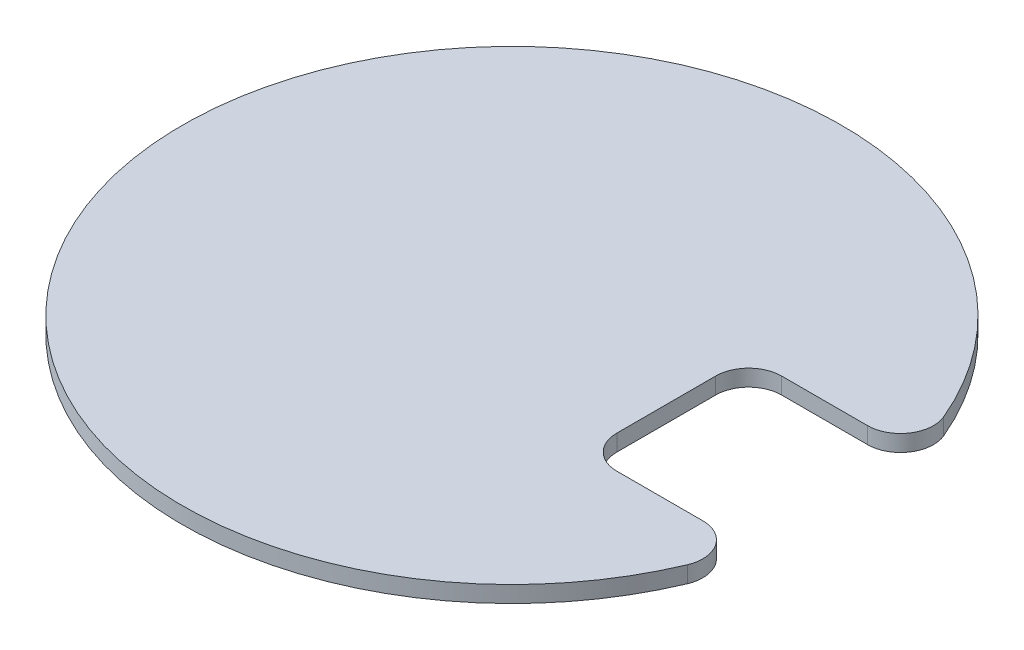
ISO-10303-21;
HEADER;
FILE_DESCRIPTION(('STEP AP214'),'2;1');
FILE_NAME('part.step','',(''),(''),'','','');
FILE_SCHEMA(('AUTOMOTIVE_DESIGN { 1 0 10303 214 1 1 1 1 }'));
ENDSEC;
DATA;
#1=APPLICATION_CONTEXT('core data for automotive mechanical design processes');
#2=APPLICATION_PROTOCOL_DEFINITION('international standard','automotive_design',2000,#1);
#3=PRODUCT_CONTEXT('',#1,'mechanical');
#4=PRODUCT('Part','Part','',(#3));
#5=PRODUCT_RELATED_PRODUCT_CATEGORY('part','',(#4));
#6=PRODUCT_DEFINITION_FORMATION('','',#4);
#7=PRODUCT_DEFINITION_CONTEXT('part definition',#1,'design');
#8=PRODUCT_DEFINITION('design','',#6,#7);
#9=PRODUCT_DEFINITION_SHAPE('','',#8);
#10=(LENGTH_UNIT() NAMED_UNIT(*) SI_UNIT(.MILLI.,.METRE.));
#11=(NAMED_UNIT(*) PLANE_ANGLE_UNIT() SI_UNIT($,.RADIAN.));
#12=(NAMED_UNIT(*) SI_UNIT($,.STERADIAN.) SOLID_ANGLE_UNIT());
#13=UNCERTAINTY_MEASURE_WITH_UNIT(LENGTH_MEASURE(1.E-05),#10,'distance_accuracy_value','');
#14=(GEOMETRIC_REPRESENTATION_CONTEXT(3) GLOBAL_UNCERTAINTY_ASSIGNED_CONTEXT((#13)) GLOBAL_UNIT_ASSIGNED_CONTEXT((#10,
#11,#12)) REPRESENTATION_CONTEXT('',''));
#15=CARTESIAN_POINT('',(0.,0.,0.));
#16=DIRECTION('',(0.,0.,1.));
#17=DIRECTION('',(1.,0.,0.));
#18=AXIS2_PLACEMENT_3D('',#15,#16,#17);
#19=CARTESIAN_POINT('',(11.3649167310371,1.,-3.));
#20=DIRECTION('',(0.,-1.,0.));
#21=DIRECTION('',(0.,0.,-1.));
#22=AXIS2_PLACEMENT_3D('',#19,#20,#21);
#23=CYLINDRICAL_SURFACE('',#22,2.);
#24=CARTESIAN_POINT('',(11.3649167310371,0.,-3.));
#25=DIRECTION('',(0.,-1.,0.));
#26=DIRECTION('',(0.,0.,1.));
#27=AXIS2_PLACEMENT_3D('',#24,#25,#26);
#28=CIRCLE('',#27,2.);
#29=CARTESIAN_POINT('',(9.36491673103708,0.,-2.99999999999999));
#30=VERTEX_POINT('',#29);
#31=CARTESIAN_POINT('',(11.3649167310371,0.,-5.));
#32=VERTEX_POINT('',#31);
#33=EDGE_CURVE('E208',#30,#32,#28,.T.);
#34=ORIENTED_EDGE('',*,*,#33,.T.);
#35=DIRECTION('',(0.,-1.,0.));
#36=VECTOR('',#35,1.);
#37=CARTESIAN_POINT('',(11.3649167310371,1.,-5.));
#38=LINE('',#37,#36);
#39=CARTESIAN_POINT('',(11.3649167310371,1.,-5.));
#40=VERTEX_POINT('',#39);
#41=EDGE_CURVE('E12',#40,#32,#38,.T.);
#42=ORIENTED_EDGE('',*,*,#41,.F.);
#43=CARTESIAN_POINT('',(11.3649167310371,1.,-3.));
#44=DIRECTION('',(0.,-1.,0.));
#45=DIRECTION('',(0.,0.,1.));
#46=AXIS2_PLACEMENT_3D('',#43,#44,#45);
#47=CIRCLE('',#46,2.);
#48=CARTESIAN_POINT('',(9.36491673103708,1.,-2.99999999999999));
#49=VERTEX_POINT('',#48);
#50=EDGE_CURVE('E162',#49,#40,#47,.T.);
#51=ORIENTED_EDGE('',*,*,#50,.F.);
#52=DIRECTION('',(0.,-1.,0.));
#53=VECTOR('',#52,1.);
#54=CARTESIAN_POINT('',(9.36491673103708,1.,-2.99999999999999));
#55=LINE('',#54,#53);
#56=EDGE_CURVE('E137',#49,#30,#55,.T.);
#57=ORIENTED_EDGE('',*,*,#56,.T.);
#58=EDGE_LOOP('',(#34,#42,#51,#57));
#59=FACE_BOUND('',#58,.T.);
#60=ADVANCED_FACE('F40',(#59),#23,.F.);
#61=CARTESIAN_POINT('',(16.583123951777,1.,-5.));
#62=DIRECTION('',(0.,0.,-1.));
#63=DIRECTION('',(-1.,0.,0.));
#64=AXIS2_PLACEMENT_3D('',#61,#62,#63);
#65=PLANE('',#64);
#66=DIRECTION('',(1.,0.,0.));
#67=VECTOR('',#66,1.);
#68=CARTESIAN_POINT('',(16.583123951777,0.,-5.));
#69=LINE('',#68,#67);
#70=CARTESIAN_POINT('',(16.583123951777,0.,-5.));
#71=VERTEX_POINT('',#70);
#72=EDGE_CURVE('E199',#32,#71,#69,.T.);
#73=ORIENTED_EDGE('',*,*,#72,.T.);
#74=DIRECTION('',(0.,-1.,0.));
#75=VECTOR('',#74,1.);
#76=CARTESIAN_POINT('',(16.583123951777,1.,-5.));
#77=LINE('',#76,#75);
#78=CARTESIAN_POINT('',(16.583123951777,1.,-5.));
#79=VERTEX_POINT('',#78);
#80=EDGE_CURVE('E49',#79,#71,#77,.T.);
#81=ORIENTED_EDGE('',*,*,#80,.F.);
#82=DIRECTION('',(1.,0.,0.));
#83=VECTOR('',#82,1.);
#84=CARTESIAN_POINT('',(16.583123951777,1.,-5.));
#85=LINE('',#84,#83);
#86=EDGE_CURVE('E100',#40,#79,#85,.T.);
#87=ORIENTED_EDGE('',*,*,#86,.F.);
#88=ORIENTED_EDGE('',*,*,#41,.T.);
#89=EDGE_LOOP('',(#73,#81,#87,#88));
#90=FACE_BOUND('',#89,.T.);
#91=ADVANCED_FACE('F230',(#90),#65,.F.);
#92=CARTESIAN_POINT('',(16.583123951777,1.,-7.));
#93=DIRECTION('',(0.,-1.,0.));
#94=DIRECTION('',(0.,0.,-1.));
#95=AXIS2_PLACEMENT_3D('',#92,#93,#94);
#96=CYLINDRICAL_SURFACE('',#95,2.);
#97=CARTESIAN_POINT('',(16.583123951777,0.,-7.));
#98=DIRECTION('',(0.,1.,0.));
#99=DIRECTION('',(0.,0.,-1.));
#100=AXIS2_PLACEMENT_3D('',#97,#98,#99);
#101=CIRCLE('',#100,2.);
#102=CARTESIAN_POINT('',(18.4256932797522,0.,-7.77777777777778));
#103=VERTEX_POINT('',#102);
#104=EDGE_CURVE('E194',#71,#103,#101,.T.);
#105=ORIENTED_EDGE('',*,*,#104,.T.);
#106=DIRECTION('',(0.,-1.,0.));
#107=VECTOR('',#106,1.);
#108=CARTESIAN_POINT('',(18.4256932797522,1.,-7.77777777777778));
#109=LINE('',#108,#107);
#110=CARTESIAN_POINT('',(18.4256932797522,1.,-7.77777777777778));
#111=VERTEX_POINT('',#110);
#112=EDGE_CURVE('E184',#111,#103,#109,.T.);
#113=ORIENTED_EDGE('',*,*,#112,.F.);
#114=CARTESIAN_POINT('',(16.583123951777,1.,-7.));
#115=DIRECTION('',(0.,1.,0.));
#116=DIRECTION('',(0.,0.,-1.));
#117=AXIS2_PLACEMENT_3D('',#114,#115,#116);
#118=CIRCLE('',#117,2.);
#119=EDGE_CURVE('E154',#79,#111,#118,.T.);
#120=ORIENTED_EDGE('',*,*,#119,.F.);
#121=ORIENTED_EDGE('',*,*,#80,.T.);
#122=EDGE_LOOP('',(#105,#113,#120,#121));
#123=FACE_BOUND('',#122,.T.);
#124=ADVANCED_FACE('F192',(#123),#96,.T.);
#125=CARTESIAN_POINT('',(0.,1.,0.));
#126=DIRECTION('',(0.,-1.,0.));
#127=DIRECTION('',(0.,0.,-1.));
#128=AXIS2_PLACEMENT_3D('',#125,#126,#127);
#129=CYLINDRICAL_SURFACE('',#128,20.);
#130=CARTESIAN_POINT('',(0.,0.,0.));
#131=DIRECTION('',(0.,1.,0.));
#132=DIRECTION('',(0.,0.,1.));
#133=AXIS2_PLACEMENT_3D('',#130,#131,#132);
#134=CIRCLE('',#133,20.);
#135=CARTESIAN_POINT('',(18.4256932797522,0.,7.77777777777778));
#136=VERTEX_POINT('',#135);
#137=EDGE_CURVE('E201',#103,#136,#134,.T.);
#138=ORIENTED_EDGE('',*,*,#137,.T.);
#139=DIRECTION('',(0.,-1.,0.));
#140=VECTOR('',#139,1.);
#141=CARTESIAN_POINT('',(18.4256932797522,1.,7.77777777777778));
#142=LINE('',#141,#140);
#143=CARTESIAN_POINT('',(18.4256932797522,1.,7.77777777777778));
#144=VERTEX_POINT('',#143);
#145=EDGE_CURVE('E180',#144,#136,#142,.T.);
#146=ORIENTED_EDGE('',*,*,#145,.F.);
#147=CARTESIAN_POINT('',(0.,1.,0.));
#148=DIRECTION('',(0.,1.,0.));
#149=DIRECTION('',(0.,0.,1.));
#150=AXIS2_PLACEMENT_3D('',#147,#148,#149);
#151=CIRCLE('',#150,20.);
#152=EDGE_CURVE('E150',#111,#144,#151,.T.);
#153=ORIENTED_EDGE('',*,*,#152,.F.);
#154=ORIENTED_EDGE('',*,*,#112,.T.);
#155=EDGE_LOOP('',(#138,#146,#153,#154));
#156=FACE_BOUND('',#155,.T.);
#157=ADVANCED_FACE('F237',(#156),#129,.T.);
#158=CARTESIAN_POINT('',(16.583123951777,1.,7.));
#159=DIRECTION('',(0.,-1.,0.));
#160=DIRECTION('',(0.,0.,-1.));
#161=AXIS2_PLACEMENT_3D('',#158,#159,#160);
#162=CYLINDRICAL_SURFACE('',#161,2.);
#163=CARTESIAN_POINT('',(16.583123951777,0.,7.));
#164=DIRECTION('',(0.,1.,0.));
#165=DIRECTION('',(0.,0.,1.));
#166=AXIS2_PLACEMENT_3D('',#163,#164,#165);
#167=CIRCLE('',#166,2.);
#168=CARTESIAN_POINT('',(16.583123951777,0.,5.));
#169=VERTEX_POINT('',#168);
#170=EDGE_CURVE('E206',#136,#169,#167,.T.);
#171=ORIENTED_EDGE('',*,*,#170,.T.);
#172=DIRECTION('',(0.,-1.,0.));
#173=VECTOR('',#172,1.);
#174=CARTESIAN_POINT('',(16.583123951777,1.,5.));
#175=LINE('',#174,#173);
#176=CARTESIAN_POINT('',(16.583123951777,1.,5.));
#177=VERTEX_POINT('',#176);
#178=EDGE_CURVE('E130',#177,#169,#175,.T.);
#179=ORIENTED_EDGE('',*,*,#178,.F.);
#180=CARTESIAN_POINT('',(16.583123951777,1.,7.));
#181=DIRECTION('',(0.,1.,0.));
#182=DIRECTION('',(0.,0.,1.));
#183=AXIS2_PLACEMENT_3D('',#180,#181,#182);
#184=CIRCLE('',#183,2.);
#185=EDGE_CURVE('E119',#144,#177,#184,.T.);
#186=ORIENTED_EDGE('',*,*,#185,.F.);
#187=ORIENTED_EDGE('',*,*,#145,.T.);
#188=EDGE_LOOP('',(#171,#179,#186,#187));
#189=FACE_BOUND('',#188,.T.);
#190=ADVANCED_FACE('F214',(#189),#162,.T.);
#191=CARTESIAN_POINT('',(11.3649167310371,1.,5.));
#192=DIRECTION('',(0.,0.,1.));
#193=DIRECTION('',(1.,0.,0.));
#194=AXIS2_PLACEMENT_3D('',#191,#192,#193);
#195=PLANE('',#194);
#196=DIRECTION('',(-1.,0.,0.));
#197=VECTOR('',#196,1.);
#198=CARTESIAN_POINT('',(11.3649167310371,0.,5.));
#199=LINE('',#198,#197);
#200=CARTESIAN_POINT('',(11.3649167310371,0.,5.));
#201=VERTEX_POINT('',#200);
#202=EDGE_CURVE('E128',#169,#201,#199,.T.);
#203=ORIENTED_EDGE('',*,*,#202,.T.);
#204=DIRECTION('',(0.,-1.,0.));
#205=VECTOR('',#204,1.);
#206=CARTESIAN_POINT('',(11.3649167310371,1.,5.));
#207=LINE('',#206,#205);
#208=CARTESIAN_POINT('',(11.3649167310371,1.,5.));
#209=VERTEX_POINT('',#208);
#210=EDGE_CURVE('E125',#209,#201,#207,.T.);
#211=ORIENTED_EDGE('',*,*,#210,.F.);
#212=DIRECTION('',(-1.,0.,0.));
#213=VECTOR('',#212,1.);
#214=CARTESIAN_POINT('',(11.3649167310371,1.,5.));
#215=LINE('',#214,#213);
#216=EDGE_CURVE('E113',#177,#209,#215,.T.);
#217=ORIENTED_EDGE('',*,*,#216,.F.);
#218=ORIENTED_EDGE('',*,*,#178,.T.);
#219=EDGE_LOOP('',(#203,#211,#217,#218));
#220=FACE_BOUND('',#219,.T.);
#221=ADVANCED_FACE('F126',(#220),#195,.F.);
#222=CARTESIAN_POINT('',(11.3649167310371,1.,3.));
#223=DIRECTION('',(0.,-1.,0.));
#224=DIRECTION('',(0.,0.,-1.));
#225=AXIS2_PLACEMENT_3D('',#222,#223,#224);
#226=CYLINDRICAL_SURFACE('',#225,2.);
#227=CARTESIAN_POINT('',(11.3649167310371,0.,3.));
#228=DIRECTION('',(0.,-1.,0.));
#229=DIRECTION('',(0.,0.,1.));
#230=AXIS2_PLACEMENT_3D('',#227,#228,#229);
#231=CIRCLE('',#230,2.);
#232=CARTESIAN_POINT('',(9.36491673103708,0.,2.99999999999999));
#233=VERTEX_POINT('',#232);
#234=EDGE_CURVE('E86',#201,#233,#231,.T.);
#235=ORIENTED_EDGE('',*,*,#234,.T.);
#236=DIRECTION('',(0.,-1.,0.));
#237=VECTOR('',#236,1.);
#238=CARTESIAN_POINT('',(9.36491673103708,1.,2.99999999999999));
#239=LINE('',#238,#237);
#240=CARTESIAN_POINT('',(9.36491673103708,1.,2.99999999999999));
#241=VERTEX_POINT('',#240);
#242=EDGE_CURVE('E131',#241,#233,#239,.T.);
#243=ORIENTED_EDGE('',*,*,#242,.F.);
#244=CARTESIAN_POINT('',(11.3649167310371,1.,3.));
#245=DIRECTION('',(0.,-1.,0.));
#246=DIRECTION('',(0.,0.,1.));
#247=AXIS2_PLACEMENT_3D('',#244,#245,#246);
#248=CIRCLE('',#247,2.);
#249=EDGE_CURVE('E117',#209,#241,#248,.T.);
#250=ORIENTED_EDGE('',*,*,#249,.F.);
#251=ORIENTED_EDGE('',*,*,#210,.T.);
#252=EDGE_LOOP('',(#235,#243,#250,#251));
#253=FACE_BOUND('',#252,.T.);
#254=ADVANCED_FACE('F133',(#253),#226,.F.);
#255=CARTESIAN_POINT('',(9.36491673103708,1.,-2.99999999999999));
#256=DIRECTION('',(-1.,0.,0.));
#257=DIRECTION('',(0.,0.,1.));
#258=AXIS2_PLACEMENT_3D('',#255,#256,#257);
#259=PLANE('',#258);
#260=DIRECTION('',(0.,0.,-1.));
#261=VECTOR('',#260,1.);
#262=CARTESIAN_POINT('',(9.36491673103708,0.,-2.99999999999999));
#263=LINE('',#262,#261);
#264=EDGE_CURVE('E92',#233,#30,#263,.T.);
#265=ORIENTED_EDGE('',*,*,#264,.T.);
#266=ORIENTED_EDGE('',*,*,#56,.F.);
#267=DIRECTION('',(0.,0.,-1.));
#268=VECTOR('',#267,1.);
#269=CARTESIAN_POINT('',(9.36491673103708,1.,-2.99999999999999));
#270=LINE('',#269,#268);
#271=EDGE_CURVE('E57',#241,#49,#270,.T.);
#272=ORIENTED_EDGE('',*,*,#271,.F.);
#273=ORIENTED_EDGE('',*,*,#242,.T.);
#274=EDGE_LOOP('',(#265,#266,#272,#273));
#275=FACE_BOUND('',#274,.T.);
#276=ADVANCED_FACE('F219',(#275),#259,.F.);
#277=CARTESIAN_POINT('',(11.3649167310371,1.,-3.));
#278=DIRECTION('',(0.,1.,0.));
#279=DIRECTION('',(0.,0.,1.));
#280=AXIS2_PLACEMENT_3D('',#277,#278,#279);
#281=PLANE('',#280);
#282=ORIENTED_EDGE('',*,*,#50,.T.);
#283=ORIENTED_EDGE('',*,*,#86,.T.);
#284=ORIENTED_EDGE('',*,*,#119,.T.);
#285=ORIENTED_EDGE('',*,*,#152,.T.);
#286=ORIENTED_EDGE('',*,*,#185,.T.);
#287=ORIENTED_EDGE('',*,*,#216,.T.);
#288=ORIENTED_EDGE('',*,*,#249,.T.);
#289=ORIENTED_EDGE('',*,*,#271,.T.);
#290=EDGE_LOOP('',(#282,#283,#284,#285,#286,#287,#288,#289));
#291=FACE_BOUND('',#290,.T.);
#292=ADVANCED_FACE('F115',(#291),#281,.T.);
#293=CARTESIAN_POINT('',(11.3649167310371,0.,-3.));
#294=DIRECTION('',(0.,1.,0.));
#295=DIRECTION('',(0.,0.,1.));
#296=AXIS2_PLACEMENT_3D('',#293,#294,#295);
#297=PLANE('',#296);
#298=ORIENTED_EDGE('',*,*,#33,.F.);
#299=ORIENTED_EDGE('',*,*,#264,.F.);
#300=ORIENTED_EDGE('',*,*,#234,.F.);
#301=ORIENTED_EDGE('',*,*,#202,.F.);
#302=ORIENTED_EDGE('',*,*,#170,.F.);
#303=ORIENTED_EDGE('',*,*,#137,.F.);
#304=ORIENTED_EDGE('',*,*,#104,.F.);
#305=ORIENTED_EDGE('',*,*,#72,.F.);
#306=EDGE_LOOP('',(#298,#299,#300,#301,#302,#303,#304,#305));
#307=FACE_BOUND('',#306,.T.);
#308=ADVANCED_FACE('F198',(#307),#297,.F.);
#309=CLOSED_SHELL('',(#60,#91,#124,#157,#190,#221,#254,#276,#292,#308));
#310=MANIFOLD_SOLID_BREP('B2',#309);
#311=ADVANCED_BREP_SHAPE_REPRESENTATION('',(#18,#310),#14);
#312=SHAPE_DEFINITION_REPRESENTATION(#9,#311);
ENDSEC;
END-ISO-10303-21;
